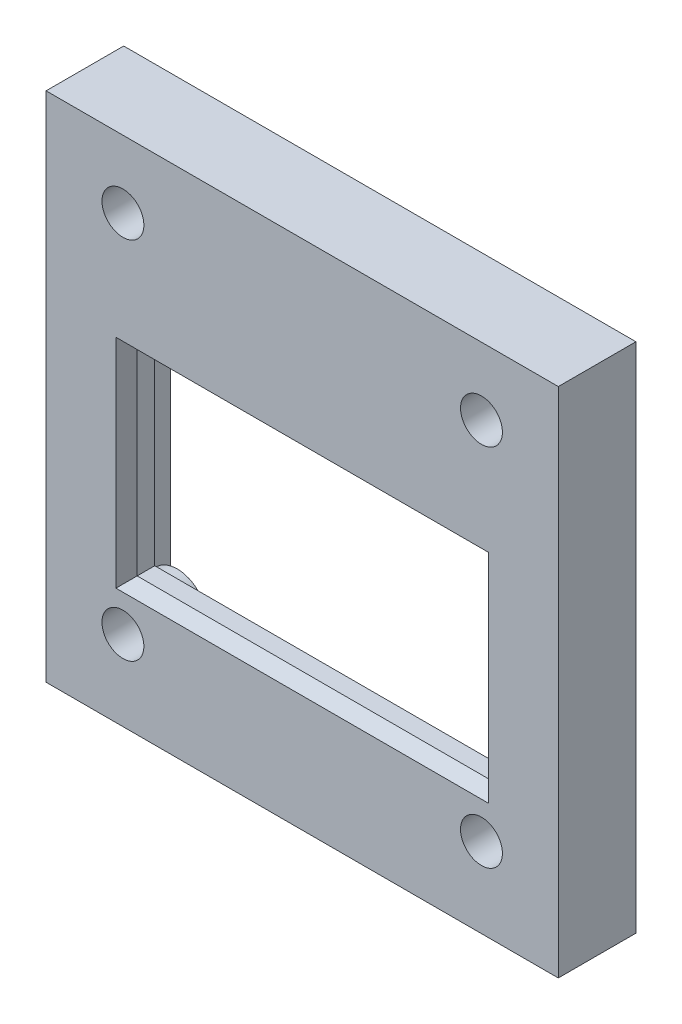
ISO-10303-21;
HEADER;
FILE_DESCRIPTION(('STEP AP214'),'2;1');
FILE_NAME('part.step','',(''),(''),'','','');
FILE_SCHEMA(('AUTOMOTIVE_DESIGN { 1 0 10303 214 1 1 1 1 }'));
ENDSEC;
DATA;
#1=APPLICATION_CONTEXT('core data for automotive mechanical design processes');
#2=APPLICATION_PROTOCOL_DEFINITION('international standard','automotive_design',2000,#1);
#3=PRODUCT_CONTEXT('',#1,'mechanical');
#4=PRODUCT('Part','Part','',(#3));
#5=PRODUCT_RELATED_PRODUCT_CATEGORY('part','',(#4));
#6=PRODUCT_DEFINITION_FORMATION('','',#4);
#7=PRODUCT_DEFINITION_CONTEXT('part definition',#1,'design');
#8=PRODUCT_DEFINITION('design','',#6,#7);
#9=PRODUCT_DEFINITION_SHAPE('','',#8);
#10=(LENGTH_UNIT() NAMED_UNIT(*) SI_UNIT(.MILLI.,.METRE.));
#11=(NAMED_UNIT(*) PLANE_ANGLE_UNIT() SI_UNIT($,.RADIAN.));
#12=(NAMED_UNIT(*) SI_UNIT($,.STERADIAN.) SOLID_ANGLE_UNIT());
#13=UNCERTAINTY_MEASURE_WITH_UNIT(LENGTH_MEASURE(1.E-05),#10,'distance_accuracy_value','');
#14=(GEOMETRIC_REPRESENTATION_CONTEXT(3) GLOBAL_UNCERTAINTY_ASSIGNED_CONTEXT((#13)) GLOBAL_UNIT_ASSIGNED_CONTEXT((#10,
#11,#12)) REPRESENTATION_CONTEXT('',''));
#15=CARTESIAN_POINT('',(0.,0.,0.));
#16=DIRECTION('',(0.,0.,1.));
#17=DIRECTION('',(1.,0.,0.));
#18=AXIS2_PLACEMENT_3D('',#15,#16,#17);
#19=CARTESIAN_POINT('',(12.9,-12.075,-3.));
#20=DIRECTION('',(0.,1.,0.));
#21=DIRECTION('',(0.,0.,1.));
#22=AXIS2_PLACEMENT_3D('',#19,#20,#21);
#23=PLANE('',#22);
#24=DIRECTION('',(0.,0.,-1.));
#25=VECTOR('',#24,1.);
#26=CARTESIAN_POINT('',(6.9,-12.075,15.0748134316813));
#27=LINE('',#26,#25);
#28=CARTESIAN_POINT('',(6.9,-12.075,0.));
#29=VERTEX_POINT('',#28);
#30=CARTESIAN_POINT('',(6.9,-12.075,-3.));
#31=VERTEX_POINT('',#30);
#32=EDGE_CURVE('E203',#29,#31,#27,.T.);
#33=ORIENTED_EDGE('',*,*,#32,.F.);
#34=DIRECTION('',(-1.,0.,0.));
#35=VECTOR('',#34,1.);
#36=CARTESIAN_POINT('',(12.9,-12.075,0.));
#37=LINE('',#36,#35);
#38=CARTESIAN_POINT('',(12.9,-12.075,0.));
#39=VERTEX_POINT('',#38);
#40=EDGE_CURVE('E263',#39,#29,#37,.T.);
#41=ORIENTED_EDGE('',*,*,#40,.F.);
#42=DIRECTION('',(0.,0.,1.));
#43=VECTOR('',#42,1.);
#44=CARTESIAN_POINT('',(12.9,-12.075,-3.));
#45=LINE('',#44,#43);
#46=CARTESIAN_POINT('',(12.9,-12.075,-3.));
#47=VERTEX_POINT('',#46);
#48=EDGE_CURVE('E277',#47,#39,#45,.T.);
#49=ORIENTED_EDGE('',*,*,#48,.F.);
#50=DIRECTION('',(-1.,0.,0.));
#51=VECTOR('',#50,1.);
#52=CARTESIAN_POINT('',(12.9,-12.075,-3.));
#53=LINE('',#52,#51);
#54=EDGE_CURVE('E251',#47,#31,#53,.T.);
#55=ORIENTED_EDGE('',*,*,#54,.T.);
#56=EDGE_LOOP('',(#33,#41,#49,#55));
#57=FACE_BOUND('',#56,.T.);
#58=ADVANCED_FACE('F57',(#57),#23,.T.);
#59=CARTESIAN_POINT('',(0.,0.,0.));
#60=DIRECTION('',(0.,0.,-1.));
#61=DIRECTION('',(-1.,0.,0.));
#62=AXIS2_PLACEMENT_3D('',#59,#60,#61);
#63=PLANE('',#62);
#64=CARTESIAN_POINT('',(-12.15,-9.42500000000001,0.));
#65=DIRECTION('',(0.,0.,-1.));
#66=DIRECTION('',(-1.,0.,0.));
#67=AXIS2_PLACEMENT_3D('',#64,#65,#66);
#68=CIRCLE('',#67,1.9);
#69=CARTESIAN_POINT('',(-14.05,-9.42500000000001,0.));
#70=VERTEX_POINT('',#69);
#71=EDGE_CURVE('E222',#70,#70,#68,.T.);
#72=ORIENTED_EDGE('',*,*,#71,.F.);
#73=EDGE_LOOP('',(#72));
#74=FACE_BOUND('',#73,.T.);
#75=CARTESIAN_POINT('',(10.95,-9.42500000000001,0.));
#76=DIRECTION('',(0.,0.,-1.));
#77=DIRECTION('',(-1.,0.,0.));
#78=AXIS2_PLACEMENT_3D('',#75,#76,#77);
#79=CIRCLE('',#78,1.9);
#80=CARTESIAN_POINT('',(9.05,-9.42500000000001,0.));
#81=VERTEX_POINT('',#80);
#82=EDGE_CURVE('E229',#81,#81,#79,.T.);
#83=ORIENTED_EDGE('',*,*,#82,.F.);
#84=EDGE_LOOP('',(#83));
#85=FACE_BOUND('',#84,.T.);
#86=CARTESIAN_POINT('',(-12.15,14.075,0.));
#87=DIRECTION('',(0.,0.,-1.));
#88=DIRECTION('',(-1.,0.,0.));
#89=AXIS2_PLACEMENT_3D('',#86,#87,#88);
#90=CIRCLE('',#89,1.9);
#91=CARTESIAN_POINT('',(-14.05,14.075,0.));
#92=VERTEX_POINT('',#91);
#93=EDGE_CURVE('E235',#92,#92,#90,.T.);
#94=ORIENTED_EDGE('',*,*,#93,.F.);
#95=EDGE_LOOP('',(#94));
#96=FACE_BOUND('',#95,.T.);
#97=CARTESIAN_POINT('',(10.95,14.075,0.));
#98=DIRECTION('',(0.,0.,-1.));
#99=DIRECTION('',(-1.,0.,0.));
#100=AXIS2_PLACEMENT_3D('',#97,#98,#99);
#101=CIRCLE('',#100,1.9);
#102=CARTESIAN_POINT('',(9.05,14.075,0.));
#103=VERTEX_POINT('',#102);
#104=EDGE_CURVE('E238',#103,#103,#101,.T.);
#105=ORIENTED_EDGE('',*,*,#104,.F.);
#106=EDGE_LOOP('',(#105));
#107=FACE_BOUND('',#106,.T.);
#108=DIRECTION('',(-1.,0.,0.));
#109=VECTOR('',#108,1.);
#110=CARTESIAN_POINT('',(10.9,6.42499999999999,0.));
#111=LINE('',#110,#109);
#112=CARTESIAN_POINT('',(10.9,6.42499999999999,0.));
#113=VERTEX_POINT('',#112);
#114=CARTESIAN_POINT('',(-12.1,6.42499999999999,0.));
#115=VERTEX_POINT('',#114);
#116=EDGE_CURVE('E303',#113,#115,#111,.T.);
#117=ORIENTED_EDGE('',*,*,#116,.T.);
#118=DIRECTION('',(0.,-1.,0.));
#119=VECTOR('',#118,1.);
#120=CARTESIAN_POINT('',(-12.1,-6.57500000000001,0.));
#121=LINE('',#120,#119);
#122=CARTESIAN_POINT('',(-12.1,-6.57500000000001,0.));
#123=VERTEX_POINT('',#122);
#124=EDGE_CURVE('E293',#115,#123,#121,.T.);
#125=ORIENTED_EDGE('',*,*,#124,.T.);
#126=DIRECTION('',(1.,0.,0.));
#127=VECTOR('',#126,1.);
#128=CARTESIAN_POINT('',(10.9,-6.57500000000001,0.));
#129=LINE('',#128,#127);
#130=CARTESIAN_POINT('',(10.9,-6.57500000000001,0.));
#131=VERTEX_POINT('',#130);
#132=EDGE_CURVE('E296',#123,#131,#129,.T.);
#133=ORIENTED_EDGE('',*,*,#132,.T.);
#134=DIRECTION('',(0.,1.,0.));
#135=VECTOR('',#134,1.);
#136=CARTESIAN_POINT('',(10.9,-6.57500000000001,0.));
#137=LINE('',#136,#135);
#138=EDGE_CURVE('E300',#131,#113,#137,.T.);
#139=ORIENTED_EDGE('',*,*,#138,.T.);
#140=EDGE_LOOP('',(#117,#125,#133,#139));
#141=FACE_BOUND('',#140,.T.);
#142=DIRECTION('',(1.,0.,0.));
#143=VECTOR('',#142,1.);
#144=CARTESIAN_POINT('',(12.9,16.075,0.));
#145=LINE('',#144,#143);
#146=CARTESIAN_POINT('',(-14.1,16.075,0.));
#147=VERTEX_POINT('',#146);
#148=CARTESIAN_POINT('',(12.9,16.075,0.));
#149=VERTEX_POINT('',#148);
#150=EDGE_CURVE('E250',#147,#149,#145,.T.);
#151=ORIENTED_EDGE('',*,*,#150,.T.);
#152=DIRECTION('',(0.,-1.,0.));
#153=VECTOR('',#152,1.);
#154=CARTESIAN_POINT('',(12.9,16.075,0.));
#155=LINE('',#154,#153);
#156=EDGE_CURVE('E258',#149,#39,#155,.T.);
#157=ORIENTED_EDGE('',*,*,#156,.T.);
#158=ORIENTED_EDGE('',*,*,#40,.T.);
#159=DIRECTION('',(0.,1.,0.));
#160=VECTOR('',#159,1.);
#161=CARTESIAN_POINT('',(6.9,-12.075,0.));
#162=LINE('',#161,#160);
#163=CARTESIAN_POINT('',(6.9,-13.575,0.));
#164=VERTEX_POINT('',#163);
#165=EDGE_CURVE('E221',#164,#29,#162,.T.);
#166=ORIENTED_EDGE('',*,*,#165,.F.);
#167=DIRECTION('',(1.,0.,0.));
#168=VECTOR('',#167,1.);
#169=CARTESIAN_POINT('',(6.9,-13.575,0.));
#170=LINE('',#169,#168);
#171=CARTESIAN_POINT('',(-8.1,-13.575,0.));
#172=VERTEX_POINT('',#171);
#173=EDGE_CURVE('E193',#172,#164,#170,.T.);
#174=ORIENTED_EDGE('',*,*,#173,.F.);
#175=DIRECTION('',(0.,-1.,0.));
#176=VECTOR('',#175,1.);
#177=CARTESIAN_POINT('',(-8.1,-12.075,0.));
#178=LINE('',#177,#176);
#179=CARTESIAN_POINT('',(-8.1,-12.075,0.));
#180=VERTEX_POINT('',#179);
#181=EDGE_CURVE('E216',#180,#172,#178,.T.);
#182=ORIENTED_EDGE('',*,*,#181,.F.);
#183=CARTESIAN_POINT('',(-14.1,-12.075,0.));
#184=VERTEX_POINT('',#183);
#185=EDGE_CURVE('E261',#180,#184,#37,.T.);
#186=ORIENTED_EDGE('',*,*,#185,.T.);
#187=DIRECTION('',(0.,1.,0.));
#188=VECTOR('',#187,1.);
#189=CARTESIAN_POINT('',(-14.1,16.075,0.));
#190=LINE('',#189,#188);
#191=EDGE_CURVE('E266',#184,#147,#190,.T.);
#192=ORIENTED_EDGE('',*,*,#191,.T.);
#193=EDGE_LOOP('',(#151,#157,#158,#166,#174,#182,#186,#192));
#194=FACE_BOUND('',#193,.T.);
#195=ADVANCED_FACE('F391',(#74,#85,#96,#107,#141,#194),#63,.T.);
#196=CARTESIAN_POINT('',(0.,0.,2.));
#197=DIRECTION('',(0.,0.,-1.));
#198=DIRECTION('',(-1.,0.,0.));
#199=AXIS2_PLACEMENT_3D('',#196,#197,#198);
#200=PLANE('',#199);
#201=CARTESIAN_POINT('',(-12.15,14.075,2.));
#202=DIRECTION('',(0.,0.,-1.));
#203=DIRECTION('',(-1.,0.,0.));
#204=AXIS2_PLACEMENT_3D('',#201,#202,#203);
#205=CIRCLE('',#204,1.35);
#206=CARTESIAN_POINT('',(-13.5,14.075,2.));
#207=VERTEX_POINT('',#206);
#208=EDGE_CURVE('E262',#207,#207,#205,.T.);
#209=ORIENTED_EDGE('',*,*,#208,.T.);
#210=EDGE_LOOP('',(#209));
#211=FACE_BOUND('',#210,.T.);
#212=CARTESIAN_POINT('',(10.95,-9.42500000000001,2.));
#213=DIRECTION('',(0.,0.,-1.));
#214=DIRECTION('',(-1.,0.,0.));
#215=AXIS2_PLACEMENT_3D('',#212,#213,#214);
#216=CIRCLE('',#215,1.35);
#217=CARTESIAN_POINT('',(9.6,-9.42500000000001,2.));
#218=VERTEX_POINT('',#217);
#219=EDGE_CURVE('E359',#218,#218,#216,.T.);
#220=ORIENTED_EDGE('',*,*,#219,.T.);
#221=EDGE_LOOP('',(#220));
#222=FACE_BOUND('',#221,.T.);
#223=CARTESIAN_POINT('',(-12.15,-9.42500000000001,2.));
#224=DIRECTION('',(0.,0.,-1.));
#225=DIRECTION('',(-1.,0.,0.));
#226=AXIS2_PLACEMENT_3D('',#223,#224,#225);
#227=CIRCLE('',#226,1.35);
#228=CARTESIAN_POINT('',(-13.5,-9.42500000000001,2.));
#229=VERTEX_POINT('',#228);
#230=EDGE_CURVE('E356',#229,#229,#227,.T.);
#231=ORIENTED_EDGE('',*,*,#230,.T.);
#232=EDGE_LOOP('',(#231));
#233=FACE_BOUND('',#232,.T.);
#234=CARTESIAN_POINT('',(10.95,14.075,2.));
#235=DIRECTION('',(0.,0.,-1.));
#236=DIRECTION('',(-1.,0.,0.));
#237=AXIS2_PLACEMENT_3D('',#234,#235,#236);
#238=CIRCLE('',#237,1.35);
#239=CARTESIAN_POINT('',(9.6,14.075,2.));
#240=VERTEX_POINT('',#239);
#241=EDGE_CURVE('E244',#240,#240,#238,.T.);
#242=ORIENTED_EDGE('',*,*,#241,.T.);
#243=EDGE_LOOP('',(#242));
#244=FACE_BOUND('',#243,.T.);
#245=DIRECTION('',(1.,0.,0.));
#246=VECTOR('',#245,1.);
#247=CARTESIAN_POINT('',(10.9,6.92499999999999,2.));
#248=LINE('',#247,#246);
#249=CARTESIAN_POINT('',(-12.6,6.92499999999999,2.));
#250=VERTEX_POINT('',#249);
#251=CARTESIAN_POINT('',(11.4,6.92499999999999,2.));
#252=VERTEX_POINT('',#251);
#253=EDGE_CURVE('E334',#250,#252,#248,.T.);
#254=ORIENTED_EDGE('',*,*,#253,.T.);
#255=DIRECTION('',(0.,-1.,0.));
#256=VECTOR('',#255,1.);
#257=CARTESIAN_POINT('',(11.4,-6.57500000000001,2.));
#258=LINE('',#257,#256);
#259=CARTESIAN_POINT('',(11.4,-7.07500000000001,2.));
#260=VERTEX_POINT('',#259);
#261=EDGE_CURVE('E340',#252,#260,#258,.T.);
#262=ORIENTED_EDGE('',*,*,#261,.T.);
#263=DIRECTION('',(-1.,0.,0.));
#264=VECTOR('',#263,1.);
#265=CARTESIAN_POINT('',(-12.1,-7.07500000000001,2.));
#266=LINE('',#265,#264);
#267=CARTESIAN_POINT('',(-12.6,-7.07500000000001,2.));
#268=VERTEX_POINT('',#267);
#269=EDGE_CURVE('E338',#260,#268,#266,.T.);
#270=ORIENTED_EDGE('',*,*,#269,.T.);
#271=DIRECTION('',(0.,1.,0.));
#272=VECTOR('',#271,1.);
#273=CARTESIAN_POINT('',(-12.6,6.42499999999999,2.));
#274=LINE('',#273,#272);
#275=EDGE_CURVE('E336',#268,#250,#274,.T.);
#276=ORIENTED_EDGE('',*,*,#275,.T.);
#277=EDGE_LOOP('',(#254,#262,#270,#276));
#278=FACE_BOUND('',#277,.T.);
#279=DIRECTION('',(0.,1.,0.));
#280=VECTOR('',#279,1.);
#281=CARTESIAN_POINT('',(15.9,-14.575,2.));
#282=LINE('',#281,#280);
#283=CARTESIAN_POINT('',(15.9,-14.575,2.));
#284=VERTEX_POINT('',#283);
#285=CARTESIAN_POINT('',(15.9,18.425,2.));
#286=VERTEX_POINT('',#285);
#287=EDGE_CURVE('E314',#284,#286,#282,.T.);
#288=ORIENTED_EDGE('',*,*,#287,.T.);
#289=DIRECTION('',(-1.,0.,0.));
#290=VECTOR('',#289,1.);
#291=CARTESIAN_POINT('',(-17.1,18.425,2.));
#292=LINE('',#291,#290);
#293=CARTESIAN_POINT('',(-17.1,18.425,2.));
#294=VERTEX_POINT('',#293);
#295=EDGE_CURVE('E317',#286,#294,#292,.T.);
#296=ORIENTED_EDGE('',*,*,#295,.T.);
#297=DIRECTION('',(0.,-1.,0.));
#298=VECTOR('',#297,1.);
#299=CARTESIAN_POINT('',(-17.1,-14.575,2.));
#300=LINE('',#299,#298);
#301=CARTESIAN_POINT('',(-17.1,-14.575,2.));
#302=VERTEX_POINT('',#301);
#303=EDGE_CURVE('E319',#294,#302,#300,.T.);
#304=ORIENTED_EDGE('',*,*,#303,.T.);
#305=DIRECTION('',(1.,0.,0.));
#306=VECTOR('',#305,1.);
#307=CARTESIAN_POINT('',(-17.1,-14.575,2.));
#308=LINE('',#307,#306);
#309=EDGE_CURVE('E321',#302,#284,#308,.T.);
#310=ORIENTED_EDGE('',*,*,#309,.T.);
#311=EDGE_LOOP('',(#288,#296,#304,#310));
#312=FACE_BOUND('',#311,.T.);
#313=ADVANCED_FACE('F394',(#211,#222,#233,#244,#278,#312),#200,.F.);
#314=CARTESIAN_POINT('',(15.9,-14.575,2.));
#315=DIRECTION('',(-1.,0.,0.));
#316=DIRECTION('',(0.,0.,1.));
#317=AXIS2_PLACEMENT_3D('',#314,#315,#316);
#318=PLANE('',#317);
#319=DIRECTION('',(0.,0.,-1.));
#320=VECTOR('',#319,1.);
#321=CARTESIAN_POINT('',(15.9,-14.575,2.));
#322=LINE('',#321,#320);
#323=CARTESIAN_POINT('',(15.9,-14.575,-3.));
#324=VERTEX_POINT('',#323);
#325=EDGE_CURVE('E323',#284,#324,#322,.T.);
#326=ORIENTED_EDGE('',*,*,#325,.T.);
#327=DIRECTION('',(0.,-1.,0.));
#328=VECTOR('',#327,1.);
#329=CARTESIAN_POINT('',(15.9,18.425,-3.));
#330=LINE('',#329,#328);
#331=CARTESIAN_POINT('',(15.9,18.425,-3.));
#332=VERTEX_POINT('',#331);
#333=EDGE_CURVE('E280',#332,#324,#330,.T.);
#334=ORIENTED_EDGE('',*,*,#333,.F.);
#335=DIRECTION('',(0.,0.,-1.));
#336=VECTOR('',#335,1.);
#337=CARTESIAN_POINT('',(15.9,18.425,2.));
#338=LINE('',#337,#336);
#339=EDGE_CURVE('E329',#286,#332,#338,.T.);
#340=ORIENTED_EDGE('',*,*,#339,.F.);
#341=ORIENTED_EDGE('',*,*,#287,.F.);
#342=EDGE_LOOP('',(#326,#334,#340,#341));
#343=FACE_BOUND('',#342,.T.);
#344=ADVANCED_FACE('F643',(#343),#318,.F.);
#345=CARTESIAN_POINT('',(-17.1,18.425,2.));
#346=DIRECTION('',(0.,-1.,0.));
#347=DIRECTION('',(0.,0.,-1.));
#348=AXIS2_PLACEMENT_3D('',#345,#346,#347);
#349=PLANE('',#348);
#350=ORIENTED_EDGE('',*,*,#339,.T.);
#351=DIRECTION('',(1.,0.,0.));
#352=VECTOR('',#351,1.);
#353=CARTESIAN_POINT('',(15.9,18.425,-3.));
#354=LINE('',#353,#352);
#355=CARTESIAN_POINT('',(-17.1,18.425,-3.));
#356=VERTEX_POINT('',#355);
#357=EDGE_CURVE('E289',#356,#332,#354,.T.);
#358=ORIENTED_EDGE('',*,*,#357,.F.);
#359=DIRECTION('',(0.,0.,-1.));
#360=VECTOR('',#359,1.);
#361=CARTESIAN_POINT('',(-17.1,18.425,2.));
#362=LINE('',#361,#360);
#363=EDGE_CURVE('E327',#294,#356,#362,.T.);
#364=ORIENTED_EDGE('',*,*,#363,.F.);
#365=ORIENTED_EDGE('',*,*,#295,.F.);
#366=EDGE_LOOP('',(#350,#358,#364,#365));
#367=FACE_BOUND('',#366,.T.);
#368=ADVANCED_FACE('F657',(#367),#349,.F.);
#369=CARTESIAN_POINT('',(-17.1,-14.575,2.));
#370=DIRECTION('',(1.,0.,0.));
#371=DIRECTION('',(0.,0.,-1.));
#372=AXIS2_PLACEMENT_3D('',#369,#370,#371);
#373=PLANE('',#372);
#374=ORIENTED_EDGE('',*,*,#363,.T.);
#375=DIRECTION('',(0.,1.,0.));
#376=VECTOR('',#375,1.);
#377=CARTESIAN_POINT('',(-17.1,18.425,-3.));
#378=LINE('',#377,#376);
#379=CARTESIAN_POINT('',(-17.1,-14.575,-3.));
#380=VERTEX_POINT('',#379);
#381=EDGE_CURVE('E286',#380,#356,#378,.T.);
#382=ORIENTED_EDGE('',*,*,#381,.F.);
#383=DIRECTION('',(0.,0.,-1.));
#384=VECTOR('',#383,1.);
#385=CARTESIAN_POINT('',(-17.1,-14.575,2.));
#386=LINE('',#385,#384);
#387=EDGE_CURVE('E325',#302,#380,#386,.T.);
#388=ORIENTED_EDGE('',*,*,#387,.F.);
#389=ORIENTED_EDGE('',*,*,#303,.F.);
#390=EDGE_LOOP('',(#374,#382,#388,#389));
#391=FACE_BOUND('',#390,.T.);
#392=ADVANCED_FACE('F670',(#391),#373,.F.);
#393=CARTESIAN_POINT('',(-17.1,-14.575,2.));
#394=DIRECTION('',(0.,1.,0.));
#395=DIRECTION('',(0.,0.,1.));
#396=AXIS2_PLACEMENT_3D('',#393,#394,#395);
#397=PLANE('',#396);
#398=ORIENTED_EDGE('',*,*,#387,.T.);
#399=DIRECTION('',(-1.,0.,0.));
#400=VECTOR('',#399,1.);
#401=CARTESIAN_POINT('',(15.9,-14.575,-3.));
#402=LINE('',#401,#400);
#403=EDGE_CURVE('E283',#324,#380,#402,.T.);
#404=ORIENTED_EDGE('',*,*,#403,.F.);
#405=ORIENTED_EDGE('',*,*,#325,.F.);
#406=ORIENTED_EDGE('',*,*,#309,.F.);
#407=EDGE_LOOP('',(#398,#404,#405,#406));
#408=FACE_BOUND('',#407,.T.);
#409=ADVANCED_FACE('F455',(#408),#397,.F.);
#410=CARTESIAN_POINT('',(-12.1,-6.57500000000001,2.));
#411=DIRECTION('',(1.,0.,0.));
#412=DIRECTION('',(0.,0.,-1.));
#413=AXIS2_PLACEMENT_3D('',#410,#411,#412);
#414=PLANE('',#413);
#415=DIRECTION('',(0.,0.,-1.));
#416=VECTOR('',#415,1.);
#417=CARTESIAN_POINT('',(-12.1,6.42499999999999,2.));
#418=LINE('',#417,#416);
#419=CARTESIAN_POINT('',(-12.1,6.42499999999999,1.13397459621556));
#420=VERTEX_POINT('',#419);
#421=EDGE_CURVE('E306',#420,#115,#418,.T.);
#422=ORIENTED_EDGE('',*,*,#421,.F.);
#423=DIRECTION('',(0.,-1.,0.));
#424=VECTOR('',#423,1.);
#425=CARTESIAN_POINT('',(-12.1,-6.57500000000001,1.13397459621556));
#426=LINE('',#425,#424);
#427=CARTESIAN_POINT('',(-12.1,-6.57500000000001,1.13397459621556));
#428=VERTEX_POINT('',#427);
#429=EDGE_CURVE('E67',#420,#428,#426,.T.);
#430=ORIENTED_EDGE('',*,*,#429,.T.);
#431=DIRECTION('',(0.,0.,-1.));
#432=VECTOR('',#431,1.);
#433=CARTESIAN_POINT('',(-12.1,-6.57500000000001,2.));
#434=LINE('',#433,#432);
#435=EDGE_CURVE('E312',#428,#123,#434,.T.);
#436=ORIENTED_EDGE('',*,*,#435,.T.);
#437=ORIENTED_EDGE('',*,*,#124,.F.);
#438=EDGE_LOOP('',(#422,#430,#436,#437));
#439=FACE_BOUND('',#438,.T.);
#440=ADVANCED_FACE('F689',(#439),#414,.T.);
#441=CARTESIAN_POINT('',(10.9,-6.57500000000001,2.));
#442=DIRECTION('',(0.,1.,0.));
#443=DIRECTION('',(-1.,0.,0.));
#444=AXIS2_PLACEMENT_3D('',#441,#442,#443);
#445=PLANE('',#444);
#446=ORIENTED_EDGE('',*,*,#435,.F.);
#447=DIRECTION('',(1.,0.,0.));
#448=VECTOR('',#447,1.);
#449=CARTESIAN_POINT('',(10.9,-6.57500000000001,1.13397459621556));
#450=LINE('',#449,#448);
#451=CARTESIAN_POINT('',(10.9,-6.57500000000001,1.13397459621556));
#452=VERTEX_POINT('',#451);
#453=EDGE_CURVE('E343',#428,#452,#450,.T.);
#454=ORIENTED_EDGE('',*,*,#453,.T.);
#455=DIRECTION('',(0.,0.,-1.));
#456=VECTOR('',#455,1.);
#457=CARTESIAN_POINT('',(10.9,-6.57500000000001,2.));
#458=LINE('',#457,#456);
#459=EDGE_CURVE('E310',#452,#131,#458,.T.);
#460=ORIENTED_EDGE('',*,*,#459,.T.);
#461=ORIENTED_EDGE('',*,*,#132,.F.);
#462=EDGE_LOOP('',(#446,#454,#460,#461));
#463=FACE_BOUND('',#462,.T.);
#464=ADVANCED_FACE('F698',(#463),#445,.T.);
#465=CARTESIAN_POINT('',(10.9,-6.57500000000001,2.));
#466=DIRECTION('',(-1.,0.,0.));
#467=DIRECTION('',(0.,0.,1.));
#468=AXIS2_PLACEMENT_3D('',#465,#466,#467);
#469=PLANE('',#468);
#470=ORIENTED_EDGE('',*,*,#459,.F.);
#471=DIRECTION('',(0.,1.,0.));
#472=VECTOR('',#471,1.);
#473=CARTESIAN_POINT('',(10.9,6.42499999999999,1.13397459621556));
#474=LINE('',#473,#472);
#475=CARTESIAN_POINT('',(10.9,6.42499999999999,1.13397459621556));
#476=VERTEX_POINT('',#475);
#477=EDGE_CURVE('E331',#452,#476,#474,.T.);
#478=ORIENTED_EDGE('',*,*,#477,.T.);
#479=DIRECTION('',(0.,0.,-1.));
#480=VECTOR('',#479,1.);
#481=CARTESIAN_POINT('',(10.9,6.42499999999999,2.));
#482=LINE('',#481,#480);
#483=EDGE_CURVE('E308',#476,#113,#482,.T.);
#484=ORIENTED_EDGE('',*,*,#483,.T.);
#485=ORIENTED_EDGE('',*,*,#138,.F.);
#486=EDGE_LOOP('',(#470,#478,#484,#485));
#487=FACE_BOUND('',#486,.T.);
#488=ADVANCED_FACE('F708',(#487),#469,.T.);
#489=CARTESIAN_POINT('',(10.9,6.42499999999999,2.));
#490=DIRECTION('',(0.,-1.,0.));
#491=DIRECTION('',(1.,0.,0.));
#492=AXIS2_PLACEMENT_3D('',#489,#490,#491);
#493=PLANE('',#492);
#494=ORIENTED_EDGE('',*,*,#483,.F.);
#495=DIRECTION('',(-1.,0.,0.));
#496=VECTOR('',#495,1.);
#497=CARTESIAN_POINT('',(-12.1,6.42499999999999,1.13397459621556));
#498=LINE('',#497,#496);
#499=EDGE_CURVE('E12',#476,#420,#498,.T.);
#500=ORIENTED_EDGE('',*,*,#499,.T.);
#501=ORIENTED_EDGE('',*,*,#421,.T.);
#502=ORIENTED_EDGE('',*,*,#116,.F.);
#503=EDGE_LOOP('',(#494,#500,#501,#502));
#504=FACE_BOUND('',#503,.T.);
#505=ADVANCED_FACE('F718',(#504),#493,.T.);
#506=CARTESIAN_POINT('',(-12.1,-6.57500000000001,1.13397459621556));
#507=DIRECTION('',(0.866025403784438,0.,0.500000000000002));
#508=DIRECTION('',(0.,1.,0.));
#509=AXIS2_PLACEMENT_3D('',#506,#507,#508);
#510=PLANE('',#509);
#511=DIRECTION('',(0.447213595499959,-0.447213595499959,-0.774596669241482));
#512=VECTOR('',#511,1.);
#513=CARTESIAN_POINT('',(-9.49999999999998,3.82499999999998,-3.36935750346352));
#514=LINE('',#513,#512);
#515=EDGE_CURVE('E349',#250,#420,#514,.T.);
#516=ORIENTED_EDGE('',*,*,#515,.F.);
#517=ORIENTED_EDGE('',*,*,#275,.F.);
#518=DIRECTION('',(0.447213595499959,0.447213595499959,-0.774596669241482));
#519=VECTOR('',#518,1.);
#520=CARTESIAN_POINT('',(-7.49999999999997,-1.97499999999999,-6.83345911860128));
#521=LINE('',#520,#519);
#522=EDGE_CURVE('E297',#428,#268,#521,.F.);
#523=ORIENTED_EDGE('',*,*,#522,.F.);
#524=ORIENTED_EDGE('',*,*,#429,.F.);
#525=EDGE_LOOP('',(#516,#517,#523,#524));
#526=FACE_BOUND('',#525,.T.);
#527=ADVANCED_FACE('F60',(#526),#510,.T.);
#528=CARTESIAN_POINT('',(10.9,-6.57500000000001,1.13397459621556));
#529=DIRECTION('',(0.,0.866025403784438,0.500000000000002));
#530=DIRECTION('',(-1.,0.,0.));
#531=AXIS2_PLACEMENT_3D('',#528,#529,#530);
#532=PLANE('',#531);
#533=ORIENTED_EDGE('',*,*,#522,.T.);
#534=ORIENTED_EDGE('',*,*,#269,.F.);
#535=DIRECTION('',(-0.447213595499959,0.447213595499959,-0.774596669241482));
#536=VECTOR('',#535,1.);
#537=CARTESIAN_POINT('',(10.9,-6.57500000000001,1.13397459621556));
#538=LINE('',#537,#536);
#539=EDGE_CURVE('E347',#452,#260,#538,.F.);
#540=ORIENTED_EDGE('',*,*,#539,.F.);
#541=ORIENTED_EDGE('',*,*,#453,.F.);
#542=EDGE_LOOP('',(#533,#534,#540,#541));
#543=FACE_BOUND('',#542,.T.);
#544=ADVANCED_FACE('F737',(#543),#532,.T.);
#545=CARTESIAN_POINT('',(10.9,6.42499999999999,1.13397459621556));
#546=DIRECTION('',(0.,-0.866025403784438,0.500000000000001));
#547=DIRECTION('',(1.,0.,0.));
#548=AXIS2_PLACEMENT_3D('',#545,#546,#547);
#549=PLANE('',#548);
#550=ORIENTED_EDGE('',*,*,#515,.T.);
#551=ORIENTED_EDGE('',*,*,#499,.F.);
#552=DIRECTION('',(0.447213595499959,0.447213595499959,0.774596669241482));
#553=VECTOR('',#552,1.);
#554=CARTESIAN_POINT('',(8.29999999999999,3.82499999999998,-3.36935750346352));
#555=LINE('',#554,#553);
#556=EDGE_CURVE('E292',#252,#476,#555,.F.);
#557=ORIENTED_EDGE('',*,*,#556,.F.);
#558=ORIENTED_EDGE('',*,*,#253,.F.);
#559=EDGE_LOOP('',(#550,#551,#557,#558));
#560=FACE_BOUND('',#559,.T.);
#561=ADVANCED_FACE('F746',(#560),#549,.T.);
#562=CARTESIAN_POINT('',(10.9,-6.57500000000001,1.13397459621556));
#563=DIRECTION('',(-0.866025403784438,0.,0.500000000000002));
#564=DIRECTION('',(0.,-1.,0.));
#565=AXIS2_PLACEMENT_3D('',#562,#563,#564);
#566=PLANE('',#565);
#567=ORIENTED_EDGE('',*,*,#539,.T.);
#568=ORIENTED_EDGE('',*,*,#261,.F.);
#569=ORIENTED_EDGE('',*,*,#556,.T.);
#570=ORIENTED_EDGE('',*,*,#477,.F.);
#571=EDGE_LOOP('',(#567,#568,#569,#570));
#572=FACE_BOUND('',#571,.T.);
#573=ADVANCED_FACE('F446',(#572),#566,.T.);
#574=CARTESIAN_POINT('',(0.,0.,-3.));
#575=DIRECTION('',(0.,0.,-1.));
#576=DIRECTION('',(-1.,0.,0.));
#577=AXIS2_PLACEMENT_3D('',#574,#575,#576);
#578=PLANE('',#577);
#579=DIRECTION('',(0.,-1.,0.));
#580=VECTOR('',#579,1.);
#581=CARTESIAN_POINT('',(6.9,-12.075,-3.));
#582=LINE('',#581,#580);
#583=CARTESIAN_POINT('',(6.9,-13.575,-3.));
#584=VERTEX_POINT('',#583);
#585=EDGE_CURVE('E200',#31,#584,#582,.T.);
#586=ORIENTED_EDGE('',*,*,#585,.F.);
#587=ORIENTED_EDGE('',*,*,#54,.F.);
#588=DIRECTION('',(0.,-1.,0.));
#589=VECTOR('',#588,1.);
#590=CARTESIAN_POINT('',(12.9,16.075,-3.));
#591=LINE('',#590,#589);
#592=CARTESIAN_POINT('',(12.9,16.075,-3.));
#593=VERTEX_POINT('',#592);
#594=EDGE_CURVE('E247',#593,#47,#591,.T.);
#595=ORIENTED_EDGE('',*,*,#594,.F.);
#596=DIRECTION('',(1.,0.,0.));
#597=VECTOR('',#596,1.);
#598=CARTESIAN_POINT('',(12.9,16.075,-3.));
#599=LINE('',#598,#597);
#600=CARTESIAN_POINT('',(-14.1,16.075,-3.));
#601=VERTEX_POINT('',#600);
#602=EDGE_CURVE('E256',#601,#593,#599,.T.);
#603=ORIENTED_EDGE('',*,*,#602,.F.);
#604=DIRECTION('',(0.,1.,0.));
#605=VECTOR('',#604,1.);
#606=CARTESIAN_POINT('',(-14.1,16.075,-3.));
#607=LINE('',#606,#605);
#608=CARTESIAN_POINT('',(-14.1,-12.075,-3.));
#609=VERTEX_POINT('',#608);
#610=EDGE_CURVE('E253',#609,#601,#607,.T.);
#611=ORIENTED_EDGE('',*,*,#610,.F.);
#612=CARTESIAN_POINT('',(-8.1,-12.075,-3.));
#613=VERTEX_POINT('',#612);
#614=EDGE_CURVE('E249',#613,#609,#53,.T.);
#615=ORIENTED_EDGE('',*,*,#614,.F.);
#616=DIRECTION('',(0.,1.,0.));
#617=VECTOR('',#616,1.);
#618=CARTESIAN_POINT('',(-8.1,-12.075,-3.));
#619=LINE('',#618,#617);
#620=CARTESIAN_POINT('',(-8.1,-13.575,-3.));
#621=VERTEX_POINT('',#620);
#622=EDGE_CURVE('E197',#621,#613,#619,.T.);
#623=ORIENTED_EDGE('',*,*,#622,.F.);
#624=DIRECTION('',(-1.,0.,0.));
#625=VECTOR('',#624,1.);
#626=CARTESIAN_POINT('',(6.9,-13.575,-3.));
#627=LINE('',#626,#625);
#628=EDGE_CURVE('E190',#584,#621,#627,.T.);
#629=ORIENTED_EDGE('',*,*,#628,.F.);
#630=EDGE_LOOP('',(#586,#587,#595,#603,#611,#615,#623,#629));
#631=FACE_BOUND('',#630,.T.);
#632=ORIENTED_EDGE('',*,*,#333,.T.);
#633=ORIENTED_EDGE('',*,*,#403,.T.);
#634=ORIENTED_EDGE('',*,*,#381,.T.);
#635=ORIENTED_EDGE('',*,*,#357,.T.);
#636=EDGE_LOOP('',(#632,#633,#634,#635));
#637=FACE_BOUND('',#636,.T.);
#638=ADVANCED_FACE('F208',(#631,#637),#578,.T.);
#639=CARTESIAN_POINT('',(12.9,16.075,-3.));
#640=DIRECTION('',(-1.,0.,0.));
#641=DIRECTION('',(0.,-1.,0.));
#642=AXIS2_PLACEMENT_3D('',#639,#640,#641);
#643=PLANE('',#642);
#644=ORIENTED_EDGE('',*,*,#156,.F.);
#645=DIRECTION('',(0.,0.,1.));
#646=VECTOR('',#645,1.);
#647=CARTESIAN_POINT('',(12.9,16.075,-3.));
#648=LINE('',#647,#646);
#649=EDGE_CURVE('E83',#593,#149,#648,.T.);
#650=ORIENTED_EDGE('',*,*,#649,.F.);
#651=ORIENTED_EDGE('',*,*,#594,.T.);
#652=ORIENTED_EDGE('',*,*,#48,.T.);
#653=EDGE_LOOP('',(#644,#650,#651,#652));
#654=FACE_BOUND('',#653,.T.);
#655=ADVANCED_FACE('F409',(#654),#643,.T.);
#656=DIRECTION('',(0.,0.,-1.));
#657=VECTOR('',#656,1.);
#658=CARTESIAN_POINT('',(-8.1,-12.075,15.0748134316813));
#659=LINE('',#658,#657);
#660=EDGE_CURVE('E75',#180,#613,#659,.T.);
#661=ORIENTED_EDGE('',*,*,#660,.T.);
#662=ORIENTED_EDGE('',*,*,#614,.T.);
#663=DIRECTION('',(0.,0.,1.));
#664=VECTOR('',#663,1.);
#665=CARTESIAN_POINT('',(-14.1,-12.075,-3.));
#666=LINE('',#665,#664);
#667=EDGE_CURVE('E274',#609,#184,#666,.T.);
#668=ORIENTED_EDGE('',*,*,#667,.T.);
#669=ORIENTED_EDGE('',*,*,#185,.F.);
#670=EDGE_LOOP('',(#661,#662,#668,#669));
#671=FACE_BOUND('',#670,.T.);
#672=ADVANCED_FACE('F415',(#671),#23,.T.);
#673=CARTESIAN_POINT('',(-14.1,16.075,-3.));
#674=DIRECTION('',(1.,0.,0.));
#675=DIRECTION('',(0.,1.,0.));
#676=AXIS2_PLACEMENT_3D('',#673,#674,#675);
#677=PLANE('',#676);
#678=ORIENTED_EDGE('',*,*,#191,.F.);
#679=ORIENTED_EDGE('',*,*,#667,.F.);
#680=ORIENTED_EDGE('',*,*,#610,.T.);
#681=DIRECTION('',(0.,0.,1.));
#682=VECTOR('',#681,1.);
#683=CARTESIAN_POINT('',(-14.1,16.075,-3.));
#684=LINE('',#683,#682);
#685=EDGE_CURVE('E272',#601,#147,#684,.T.);
#686=ORIENTED_EDGE('',*,*,#685,.T.);
#687=EDGE_LOOP('',(#678,#679,#680,#686));
#688=FACE_BOUND('',#687,.T.);
#689=ADVANCED_FACE('F405',(#688),#677,.T.);
#690=CARTESIAN_POINT('',(12.9,16.075,-3.));
#691=DIRECTION('',(0.,-1.,0.));
#692=DIRECTION('',(0.,0.,-1.));
#693=AXIS2_PLACEMENT_3D('',#690,#691,#692);
#694=PLANE('',#693);
#695=ORIENTED_EDGE('',*,*,#150,.F.);
#696=ORIENTED_EDGE('',*,*,#685,.F.);
#697=ORIENTED_EDGE('',*,*,#602,.T.);
#698=ORIENTED_EDGE('',*,*,#649,.T.);
#699=EDGE_LOOP('',(#695,#696,#697,#698));
#700=FACE_BOUND('',#699,.T.);
#701=ADVANCED_FACE('F400',(#700),#694,.T.);
#702=CARTESIAN_POINT('',(10.95,14.075,3.));
#703=DIRECTION('',(0.,0.,-1.));
#704=DIRECTION('',(-1.,0.,0.));
#705=AXIS2_PLACEMENT_3D('',#702,#703,#704);
#706=CYLINDRICAL_SURFACE('',#705,1.35);
#707=ORIENTED_EDGE('',*,*,#241,.F.);
#708=EDGE_LOOP('',(#707));
#709=FACE_BOUND('',#708,.T.);
#710=CARTESIAN_POINT('',(10.95,14.075,-1.5));
#711=DIRECTION('',(0.,0.,-1.));
#712=DIRECTION('',(-1.,0.,0.));
#713=AXIS2_PLACEMENT_3D('',#710,#711,#712);
#714=CIRCLE('',#713,1.35);
#715=CARTESIAN_POINT('',(9.6,14.075,-1.5));
#716=VERTEX_POINT('',#715);
#717=EDGE_CURVE('E62',#716,#716,#714,.T.);
#718=ORIENTED_EDGE('',*,*,#717,.T.);
#719=EDGE_LOOP('',(#718));
#720=FACE_BOUND('',#719,.T.);
#721=ADVANCED_FACE('F375',(#709,#720),#706,.F.);
#722=CARTESIAN_POINT('',(-12.15,-9.42500000000001,3.));
#723=DIRECTION('',(0.,0.,-1.));
#724=DIRECTION('',(-1.,0.,0.));
#725=AXIS2_PLACEMENT_3D('',#722,#723,#724);
#726=CYLINDRICAL_SURFACE('',#725,1.35);
#727=ORIENTED_EDGE('',*,*,#230,.F.);
#728=EDGE_LOOP('',(#727));
#729=FACE_BOUND('',#728,.T.);
#730=CARTESIAN_POINT('',(-12.15,-9.42500000000001,-1.5));
#731=DIRECTION('',(0.,0.,-1.));
#732=DIRECTION('',(-1.,0.,0.));
#733=AXIS2_PLACEMENT_3D('',#730,#731,#732);
#734=CIRCLE('',#733,1.35);
#735=CARTESIAN_POINT('',(-13.5,-9.42500000000001,-1.5));
#736=VERTEX_POINT('',#735);
#737=EDGE_CURVE('E220',#736,#736,#734,.T.);
#738=ORIENTED_EDGE('',*,*,#737,.T.);
#739=EDGE_LOOP('',(#738));
#740=FACE_BOUND('',#739,.T.);
#741=ADVANCED_FACE('F491',(#729,#740),#726,.F.);
#742=CARTESIAN_POINT('',(10.95,-9.42500000000001,3.));
#743=DIRECTION('',(0.,0.,-1.));
#744=DIRECTION('',(-1.,0.,0.));
#745=AXIS2_PLACEMENT_3D('',#742,#743,#744);
#746=CYLINDRICAL_SURFACE('',#745,1.35);
#747=ORIENTED_EDGE('',*,*,#219,.F.);
#748=EDGE_LOOP('',(#747));
#749=FACE_BOUND('',#748,.T.);
#750=CARTESIAN_POINT('',(10.95,-9.42500000000001,-1.5));
#751=DIRECTION('',(0.,0.,-1.));
#752=DIRECTION('',(-1.,0.,0.));
#753=AXIS2_PLACEMENT_3D('',#750,#751,#752);
#754=CIRCLE('',#753,1.35);
#755=CARTESIAN_POINT('',(9.6,-9.42500000000001,-1.5));
#756=VERTEX_POINT('',#755);
#757=EDGE_CURVE('E366',#756,#756,#754,.T.);
#758=ORIENTED_EDGE('',*,*,#757,.T.);
#759=EDGE_LOOP('',(#758));
#760=FACE_BOUND('',#759,.T.);
#761=ADVANCED_FACE('F504',(#749,#760),#746,.F.);
#762=CARTESIAN_POINT('',(-12.15,14.075,3.));
#763=DIRECTION('',(0.,0.,-1.));
#764=DIRECTION('',(-1.,0.,0.));
#765=AXIS2_PLACEMENT_3D('',#762,#763,#764);
#766=CYLINDRICAL_SURFACE('',#765,1.35);
#767=ORIENTED_EDGE('',*,*,#208,.F.);
#768=EDGE_LOOP('',(#767));
#769=FACE_BOUND('',#768,.T.);
#770=CARTESIAN_POINT('',(-12.15,14.075,-1.5));
#771=DIRECTION('',(0.,0.,-1.));
#772=DIRECTION('',(-1.,0.,0.));
#773=AXIS2_PLACEMENT_3D('',#770,#771,#772);
#774=CIRCLE('',#773,1.35);
#775=CARTESIAN_POINT('',(-13.5,14.075,-1.5));
#776=VERTEX_POINT('',#775);
#777=EDGE_CURVE('E368',#776,#776,#774,.T.);
#778=ORIENTED_EDGE('',*,*,#777,.T.);
#779=EDGE_LOOP('',(#778));
#780=FACE_BOUND('',#779,.T.);
#781=ADVANCED_FACE('F381',(#769,#780),#766,.F.);
#782=CARTESIAN_POINT('',(10.95,14.075,-1.5));
#783=DIRECTION('',(0.,0.,-1.));
#784=DIRECTION('',(-1.,0.,0.));
#785=AXIS2_PLACEMENT_3D('',#782,#783,#784);
#786=PLANE('',#785);
#787=ORIENTED_EDGE('',*,*,#717,.F.);
#788=EDGE_LOOP('',(#787));
#789=FACE_BOUND('',#788,.T.);
#790=CARTESIAN_POINT('',(10.95,14.075,-1.5));
#791=DIRECTION('',(0.,0.,-1.));
#792=DIRECTION('',(-1.,0.,0.));
#793=AXIS2_PLACEMENT_3D('',#790,#791,#792);
#794=CIRCLE('',#793,1.9);
#795=CARTESIAN_POINT('',(9.05,14.075,-1.5));
#796=VERTEX_POINT('',#795);
#797=EDGE_CURVE('E241',#796,#796,#794,.T.);
#798=ORIENTED_EDGE('',*,*,#797,.T.);
#799=EDGE_LOOP('',(#798));
#800=FACE_BOUND('',#799,.T.);
#801=ADVANCED_FACE('F377',(#789,#800),#786,.T.);
#802=CARTESIAN_POINT('',(10.95,14.075,-1.5));
#803=DIRECTION('',(0.,0.,1.));
#804=DIRECTION('',(1.,0.,0.));
#805=AXIS2_PLACEMENT_3D('',#802,#803,#804);
#806=CYLINDRICAL_SURFACE('',#805,1.9);
#807=ORIENTED_EDGE('',*,*,#797,.F.);
#808=EDGE_LOOP('',(#807));
#809=FACE_BOUND('',#808,.T.);
#810=ORIENTED_EDGE('',*,*,#104,.T.);
#811=EDGE_LOOP('',(#810));
#812=FACE_BOUND('',#811,.T.);
#813=ADVANCED_FACE('F380',(#809,#812),#806,.T.);
#814=CARTESIAN_POINT('',(-12.15,14.075,-1.5));
#815=DIRECTION('',(0.,0.,-1.));
#816=DIRECTION('',(-1.,0.,0.));
#817=AXIS2_PLACEMENT_3D('',#814,#815,#816);
#818=PLANE('',#817);
#819=ORIENTED_EDGE('',*,*,#777,.F.);
#820=EDGE_LOOP('',(#819));
#821=FACE_BOUND('',#820,.T.);
#822=CARTESIAN_POINT('',(-12.15,14.075,-1.5));
#823=DIRECTION('',(0.,0.,-1.));
#824=DIRECTION('',(-1.,0.,0.));
#825=AXIS2_PLACEMENT_3D('',#822,#823,#824);
#826=CIRCLE('',#825,1.9);
#827=CARTESIAN_POINT('',(-14.05,14.075,-1.5));
#828=VERTEX_POINT('',#827);
#829=EDGE_CURVE('E232',#828,#828,#826,.T.);
#830=ORIENTED_EDGE('',*,*,#829,.T.);
#831=EDGE_LOOP('',(#830));
#832=FACE_BOUND('',#831,.T.);
#833=ADVANCED_FACE('F387',(#821,#832),#818,.T.);
#834=CARTESIAN_POINT('',(-12.15,14.075,-1.5));
#835=DIRECTION('',(0.,0.,1.));
#836=DIRECTION('',(1.,0.,0.));
#837=AXIS2_PLACEMENT_3D('',#834,#835,#836);
#838=CYLINDRICAL_SURFACE('',#837,1.9);
#839=ORIENTED_EDGE('',*,*,#829,.F.);
#840=EDGE_LOOP('',(#839));
#841=FACE_BOUND('',#840,.T.);
#842=ORIENTED_EDGE('',*,*,#93,.T.);
#843=EDGE_LOOP('',(#842));
#844=FACE_BOUND('',#843,.T.);
#845=ADVANCED_FACE('F553',(#841,#844),#838,.T.);
#846=CARTESIAN_POINT('',(10.95,-9.42500000000001,-1.5));
#847=DIRECTION('',(0.,0.,-1.));
#848=DIRECTION('',(-1.,0.,0.));
#849=AXIS2_PLACEMENT_3D('',#846,#847,#848);
#850=PLANE('',#849);
#851=ORIENTED_EDGE('',*,*,#757,.F.);
#852=EDGE_LOOP('',(#851));
#853=FACE_BOUND('',#852,.T.);
#854=CARTESIAN_POINT('',(10.95,-9.42500000000001,-1.5));
#855=DIRECTION('',(0.,0.,-1.));
#856=DIRECTION('',(-1.,0.,0.));
#857=AXIS2_PLACEMENT_3D('',#854,#855,#856);
#858=CIRCLE('',#857,1.9);
#859=CARTESIAN_POINT('',(9.05,-9.42500000000001,-1.5));
#860=VERTEX_POINT('',#859);
#861=EDGE_CURVE('E225',#860,#860,#858,.T.);
#862=ORIENTED_EDGE('',*,*,#861,.T.);
#863=EDGE_LOOP('',(#862));
#864=FACE_BOUND('',#863,.T.);
#865=ADVANCED_FACE('F562',(#853,#864),#850,.T.);
#866=CARTESIAN_POINT('',(10.95,-9.42500000000001,-1.5));
#867=DIRECTION('',(0.,0.,1.));
#868=DIRECTION('',(1.,0.,0.));
#869=AXIS2_PLACEMENT_3D('',#866,#867,#868);
#870=CYLINDRICAL_SURFACE('',#869,1.9);
#871=ORIENTED_EDGE('',*,*,#861,.F.);
#872=EDGE_LOOP('',(#871));
#873=FACE_BOUND('',#872,.T.);
#874=ORIENTED_EDGE('',*,*,#82,.T.);
#875=EDGE_LOOP('',(#874));
#876=FACE_BOUND('',#875,.T.);
#877=ADVANCED_FACE('F572',(#873,#876),#870,.T.);
#878=CARTESIAN_POINT('',(-12.15,-9.42500000000001,-1.5));
#879=DIRECTION('',(0.,0.,-1.));
#880=DIRECTION('',(-1.,0.,0.));
#881=AXIS2_PLACEMENT_3D('',#878,#879,#880);
#882=PLANE('',#881);
#883=ORIENTED_EDGE('',*,*,#737,.F.);
#884=EDGE_LOOP('',(#883));
#885=FACE_BOUND('',#884,.T.);
#886=CARTESIAN_POINT('',(-12.15,-9.42500000000001,-1.5));
#887=DIRECTION('',(0.,0.,-1.));
#888=DIRECTION('',(-1.,0.,0.));
#889=AXIS2_PLACEMENT_3D('',#886,#887,#888);
#890=CIRCLE('',#889,1.9);
#891=CARTESIAN_POINT('',(-14.05,-9.42500000000001,-1.5));
#892=VERTEX_POINT('',#891);
#893=EDGE_CURVE('E226',#892,#892,#890,.T.);
#894=ORIENTED_EDGE('',*,*,#893,.T.);
#895=EDGE_LOOP('',(#894));
#896=FACE_BOUND('',#895,.T.);
#897=ADVANCED_FACE('F434',(#885,#896),#882,.T.);
#898=CARTESIAN_POINT('',(-12.15,-9.42500000000001,-1.5));
#899=DIRECTION('',(0.,0.,1.));
#900=DIRECTION('',(1.,0.,0.));
#901=AXIS2_PLACEMENT_3D('',#898,#899,#900);
#902=CYLINDRICAL_SURFACE('',#901,1.9);
#903=ORIENTED_EDGE('',*,*,#893,.F.);
#904=EDGE_LOOP('',(#903));
#905=FACE_BOUND('',#904,.T.);
#906=ORIENTED_EDGE('',*,*,#71,.T.);
#907=EDGE_LOOP('',(#906));
#908=FACE_BOUND('',#907,.T.);
#909=ADVANCED_FACE('F588',(#905,#908),#902,.T.);
#910=CARTESIAN_POINT('',(6.9,-12.075,15.0748134316813));
#911=DIRECTION('',(1.,0.,0.));
#912=DIRECTION('',(0.,0.,-1.));
#913=AXIS2_PLACEMENT_3D('',#910,#911,#912);
#914=PLANE('',#913);
#915=ORIENTED_EDGE('',*,*,#165,.T.);
#916=ORIENTED_EDGE('',*,*,#32,.T.);
#917=ORIENTED_EDGE('',*,*,#585,.T.);
#918=DIRECTION('',(0.,0.,-1.));
#919=VECTOR('',#918,1.);
#920=CARTESIAN_POINT('',(6.9,-13.575,15.0748134316813));
#921=LINE('',#920,#919);
#922=EDGE_CURVE('E185',#164,#584,#921,.T.);
#923=ORIENTED_EDGE('',*,*,#922,.F.);
#924=EDGE_LOOP('',(#915,#916,#917,#923));
#925=FACE_BOUND('',#924,.T.);
#926=ADVANCED_FACE('F201',(#925),#914,.F.);
#927=CARTESIAN_POINT('',(-8.1,-12.075,15.0748134316813));
#928=DIRECTION('',(-1.,0.,0.));
#929=DIRECTION('',(0.,0.,1.));
#930=AXIS2_PLACEMENT_3D('',#927,#928,#929);
#931=PLANE('',#930);
#932=ORIENTED_EDGE('',*,*,#181,.T.);
#933=DIRECTION('',(0.,0.,-1.));
#934=VECTOR('',#933,1.);
#935=CARTESIAN_POINT('',(-8.1,-13.575,15.0748134316813));
#936=LINE('',#935,#934);
#937=EDGE_CURVE('E196',#172,#621,#936,.T.);
#938=ORIENTED_EDGE('',*,*,#937,.T.);
#939=ORIENTED_EDGE('',*,*,#622,.T.);
#940=ORIENTED_EDGE('',*,*,#660,.F.);
#941=EDGE_LOOP('',(#932,#938,#939,#940));
#942=FACE_BOUND('',#941,.T.);
#943=ADVANCED_FACE('F412',(#942),#931,.F.);
#944=CARTESIAN_POINT('',(6.9,-13.575,15.0748134316813));
#945=DIRECTION('',(0.,-1.,0.));
#946=DIRECTION('',(1.,0.,0.));
#947=AXIS2_PLACEMENT_3D('',#944,#945,#946);
#948=PLANE('',#947);
#949=ORIENTED_EDGE('',*,*,#173,.T.);
#950=ORIENTED_EDGE('',*,*,#922,.T.);
#951=ORIENTED_EDGE('',*,*,#628,.T.);
#952=ORIENTED_EDGE('',*,*,#937,.F.);
#953=EDGE_LOOP('',(#949,#950,#951,#952));
#954=FACE_BOUND('',#953,.T.);
#955=ADVANCED_FACE('F187',(#954),#948,.F.);
#956=CLOSED_SHELL('',(#58,#195,#313,#344,#368,#392,#409,#440,#464,#488,#505,#527,#544,#561,#573,
#638,#655,#672,#689,#701,#721,#741,#761,#781,#801,#813,#833,#845,#865,#877,#897,#909,#926,#943,#955));
#957=MANIFOLD_SOLID_BREP('B2',#956);
#958=ADVANCED_BREP_SHAPE_REPRESENTATION('',(#18,#957),#14);
#959=SHAPE_DEFINITION_REPRESENTATION(#9,#958);
ENDSEC;
END-ISO-10303-21;
